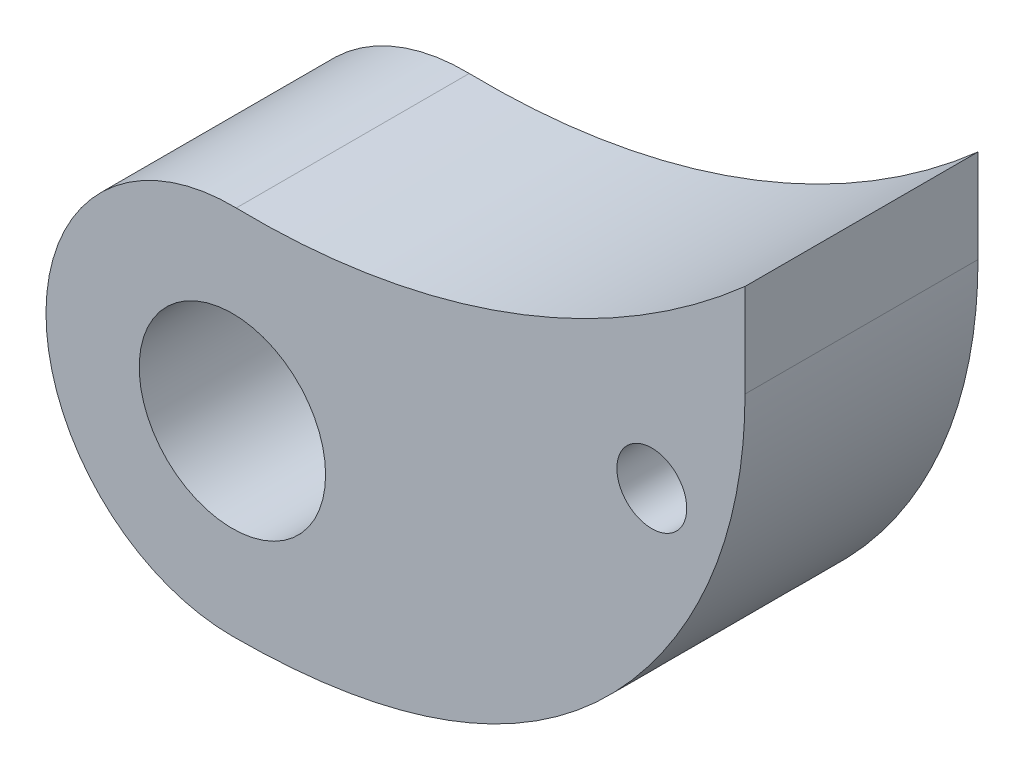
ISO-10303-21;
HEADER;
FILE_DESCRIPTION(('STEP AP214'),'2;1');
FILE_NAME('part.step','',(''),(''),'','','');
FILE_SCHEMA(('AUTOMOTIVE_DESIGN { 1 0 10303 214 1 1 1 1 }'));
ENDSEC;
DATA;
#1=APPLICATION_CONTEXT('core data for automotive mechanical design processes');
#2=APPLICATION_PROTOCOL_DEFINITION('international standard','automotive_design',2000,#1);
#3=PRODUCT_CONTEXT('',#1,'mechanical');
#4=PRODUCT('Part','Part','',(#3));
#5=PRODUCT_RELATED_PRODUCT_CATEGORY('part','',(#4));
#6=PRODUCT_DEFINITION_FORMATION('','',#4);
#7=PRODUCT_DEFINITION_CONTEXT('part definition',#1,'design');
#8=PRODUCT_DEFINITION('design','',#6,#7);
#9=PRODUCT_DEFINITION_SHAPE('','',#8);
#10=(LENGTH_UNIT() NAMED_UNIT(*) SI_UNIT(.MILLI.,.METRE.));
#11=(NAMED_UNIT(*) PLANE_ANGLE_UNIT() SI_UNIT($,.RADIAN.));
#12=(NAMED_UNIT(*) SI_UNIT($,.STERADIAN.) SOLID_ANGLE_UNIT());
#13=UNCERTAINTY_MEASURE_WITH_UNIT(LENGTH_MEASURE(1.E-05),#10,'distance_accuracy_value','');
#14=(GEOMETRIC_REPRESENTATION_CONTEXT(3) GLOBAL_UNCERTAINTY_ASSIGNED_CONTEXT((#13)) GLOBAL_UNIT_ASSIGNED_CONTEXT((#10,
#11,#12)) REPRESENTATION_CONTEXT('',''));
#15=CARTESIAN_POINT('',(0.,0.,0.));
#16=DIRECTION('',(0.,0.,1.));
#17=DIRECTION('',(1.,0.,0.));
#18=AXIS2_PLACEMENT_3D('',#15,#16,#17);
#19=CARTESIAN_POINT('',(0.412180191892476,19.9957522361478,5.));
#20=DIRECTION('',(0.,0.,1.));
#21=DIRECTION('',(1.,0.,0.));
#22=AXIS2_PLACEMENT_3D('',#19,#20,#21);
#23=PLANE('',#22);
#24=CARTESIAN_POINT('',(0.,0.,5.));
#25=DIRECTION('',(0.,0.,1.));
#26=DIRECTION('',(1.,0.,0.));
#27=AXIS2_PLACEMENT_3D('',#24,#25,#26);
#28=CIRCLE('',#27,2.);
#29=CARTESIAN_POINT('',(2.,0.,5.));
#30=VERTEX_POINT('',#29);
#31=EDGE_CURVE('E147',#30,#30,#28,.T.);
#32=ORIENTED_EDGE('',*,*,#31,.F.);
#33=EDGE_LOOP('',(#32));
#34=FACE_BOUND('',#33,.T.);
#35=CARTESIAN_POINT('',(0.412180191892476,19.9957522361478,5.));
#36=DIRECTION('',(0.,0.,-1.));
#37=DIRECTION('',(1.,0.,0.));
#38=AXIS2_PLACEMENT_3D('',#35,#36,#37);
#39=CIRCLE('',#38,16.);
#40=CARTESIAN_POINT('',(11.,8.,5.));
#41=VERTEX_POINT('',#40);
#42=CARTESIAN_POINT('',(0.0824360383784953,3.99915044722957,5.));
#43=VERTEX_POINT('',#42);
#44=EDGE_CURVE('E88',#41,#43,#39,.T.);
#45=ORIENTED_EDGE('',*,*,#44,.T.);
#46=CARTESIAN_POINT('',(0.,0.,5.));
#47=DIRECTION('',(0.,0.,1.));
#48=DIRECTION('',(1.,0.,0.));
#49=AXIS2_PLACEMENT_3D('',#46,#47,#48);
#50=CIRCLE('',#49,4.);
#51=CARTESIAN_POINT('',(0.,-4.,5.));
#52=VERTEX_POINT('',#51);
#53=EDGE_CURVE('E83',#43,#52,#50,.T.);
#54=ORIENTED_EDGE('',*,*,#53,.T.);
#55=CARTESIAN_POINT('',(0.,-4.,5.));
#56=CARTESIAN_POINT('',(4.2020349893536,-4.,5.));
#57=CARTESIAN_POINT('',(8.98329257181985,-1.55655756657849,5.));
#58=CARTESIAN_POINT('',(11.,3.64860659413861,5.));
#59=CARTESIAN_POINT('',(11.,6.,5.));
#60=B_SPLINE_CURVE_WITH_KNOTS('',3,(#55,#56,#57,#58,#59),.UNSPECIFIED.,.F.,.F.,(4,1,4),(0.,
0.608953578779127,1.),.UNSPECIFIED.);
#61=CARTESIAN_POINT('',(11.,6.,5.));
#62=VERTEX_POINT('',#61);
#63=EDGE_CURVE('E86',#52,#62,#60,.T.);
#64=ORIENTED_EDGE('',*,*,#63,.T.);
#65=DIRECTION('',(0.,1.,0.));
#66=VECTOR('',#65,1.);
#67=CARTESIAN_POINT('',(11.,8.,5.));
#68=LINE('',#67,#66);
#69=EDGE_CURVE('E53',#62,#41,#68,.T.);
#70=ORIENTED_EDGE('',*,*,#69,.T.);
#71=EDGE_LOOP('',(#45,#54,#64,#70));
#72=FACE_BOUND('',#71,.T.);
#73=CARTESIAN_POINT('',(9.,3.24788813764988,5.));
#74=DIRECTION('',(0.,0.,1.));
#75=DIRECTION('',(1.,0.,0.));
#76=AXIS2_PLACEMENT_3D('',#73,#74,#75);
#77=CIRCLE('',#76,0.750000000000002);
#78=CARTESIAN_POINT('',(9.75,3.24788813764988,5.));
#79=VERTEX_POINT('',#78);
#80=EDGE_CURVE('E138',#79,#79,#77,.T.);
#81=ORIENTED_EDGE('',*,*,#80,.F.);
#82=EDGE_LOOP('',(#81));
#83=FACE_BOUND('',#82,.T.);
#84=ADVANCED_FACE('F36',(#34,#72,#83),#23,.T.);
#85=CARTESIAN_POINT('',(0.412180191892476,19.9957522361478,0.));
#86=DIRECTION('',(0.,0.,1.));
#87=DIRECTION('',(1.,0.,0.));
#88=AXIS2_PLACEMENT_3D('',#85,#86,#87);
#89=PLANE('',#88);
#90=CARTESIAN_POINT('',(0.412180191892476,19.9957522361478,0.));
#91=DIRECTION('',(0.,0.,-1.));
#92=DIRECTION('',(1.,0.,0.));
#93=AXIS2_PLACEMENT_3D('',#90,#91,#92);
#94=CIRCLE('',#93,16.);
#95=CARTESIAN_POINT('',(11.,8.,0.));
#96=VERTEX_POINT('',#95);
#97=CARTESIAN_POINT('',(0.0824360383784953,3.99915044722957,0.));
#98=VERTEX_POINT('',#97);
#99=EDGE_CURVE('E150',#96,#98,#94,.T.);
#100=ORIENTED_EDGE('',*,*,#99,.F.);
#101=DIRECTION('',(0.,1.,0.));
#102=VECTOR('',#101,1.);
#103=CARTESIAN_POINT('',(11.,8.,0.));
#104=LINE('',#103,#102);
#105=CARTESIAN_POINT('',(11.,6.,0.));
#106=VERTEX_POINT('',#105);
#107=EDGE_CURVE('E76',#106,#96,#104,.T.);
#108=ORIENTED_EDGE('',*,*,#107,.F.);
#109=CARTESIAN_POINT('',(0.,-4.,0.));
#110=CARTESIAN_POINT('',(4.2020349893536,-4.,0.));
#111=CARTESIAN_POINT('',(8.98329257181985,-1.55655756657849,0.));
#112=CARTESIAN_POINT('',(11.,3.64860659413861,0.));
#113=CARTESIAN_POINT('',(11.,6.,0.));
#114=B_SPLINE_CURVE_WITH_KNOTS('',3,(#109,#110,#111,#112,#113),.UNSPECIFIED.,.F.,.F.,(4,1,4),
(0.,0.608953578779127,1.),.UNSPECIFIED.);
#115=CARTESIAN_POINT('',(0.,-4.,0.));
#116=VERTEX_POINT('',#115);
#117=EDGE_CURVE('E70',#116,#106,#114,.T.);
#118=ORIENTED_EDGE('',*,*,#117,.F.);
#119=CARTESIAN_POINT('',(0.,0.,0.));
#120=DIRECTION('',(0.,0.,1.));
#121=DIRECTION('',(1.,0.,0.));
#122=AXIS2_PLACEMENT_3D('',#119,#120,#121);
#123=CIRCLE('',#122,4.);
#124=EDGE_CURVE('E92',#98,#116,#123,.T.);
#125=ORIENTED_EDGE('',*,*,#124,.F.);
#126=EDGE_LOOP('',(#100,#108,#118,#125));
#127=FACE_BOUND('',#126,.T.);
#128=CARTESIAN_POINT('',(0.,0.,0.));
#129=DIRECTION('',(0.,0.,1.));
#130=DIRECTION('',(1.,0.,0.));
#131=AXIS2_PLACEMENT_3D('',#128,#129,#130);
#132=CIRCLE('',#131,2.);
#133=CARTESIAN_POINT('',(2.,0.,0.));
#134=VERTEX_POINT('',#133);
#135=EDGE_CURVE('E144',#134,#134,#132,.T.);
#136=ORIENTED_EDGE('',*,*,#135,.T.);
#137=EDGE_LOOP('',(#136));
#138=FACE_BOUND('',#137,.T.);
#139=CARTESIAN_POINT('',(9.,3.24788813764988,0.));
#140=DIRECTION('',(0.,0.,1.));
#141=DIRECTION('',(1.,0.,0.));
#142=AXIS2_PLACEMENT_3D('',#139,#140,#141);
#143=CIRCLE('',#142,0.750000000000002);
#144=CARTESIAN_POINT('',(9.75,3.24788813764988,0.));
#145=VERTEX_POINT('',#144);
#146=EDGE_CURVE('E141',#145,#145,#143,.T.);
#147=ORIENTED_EDGE('',*,*,#146,.T.);
#148=EDGE_LOOP('',(#147));
#149=FACE_BOUND('',#148,.T.);
#150=ADVANCED_FACE('F115',(#127,#138,#149),#89,.F.);
#151=CARTESIAN_POINT('',(0.412180191892476,19.9957522361478,5.));
#152=DIRECTION('',(0.,0.,-1.));
#153=DIRECTION('',(-1.,0.,0.));
#154=AXIS2_PLACEMENT_3D('',#151,#152,#153);
#155=CYLINDRICAL_SURFACE('',#154,16.);
#156=ORIENTED_EDGE('',*,*,#99,.T.);
#157=DIRECTION('',(0.,0.,-1.));
#158=VECTOR('',#157,1.);
#159=CARTESIAN_POINT('',(0.0824360383784953,3.99915044722957,5.));
#160=LINE('',#159,#158);
#161=EDGE_CURVE('E11',#43,#98,#160,.T.);
#162=ORIENTED_EDGE('',*,*,#161,.F.);
#163=ORIENTED_EDGE('',*,*,#44,.F.);
#164=DIRECTION('',(0.,0.,-1.));
#165=VECTOR('',#164,1.);
#166=CARTESIAN_POINT('',(11.,8.,5.));
#167=LINE('',#166,#165);
#168=EDGE_CURVE('E96',#41,#96,#167,.T.);
#169=ORIENTED_EDGE('',*,*,#168,.T.);
#170=EDGE_LOOP('',(#156,#162,#163,#169));
#171=FACE_BOUND('',#170,.T.);
#172=ADVANCED_FACE('F38',(#171),#155,.F.);
#173=CARTESIAN_POINT('',(0.,0.,5.));
#174=DIRECTION('',(0.,0.,-1.));
#175=DIRECTION('',(-1.,0.,0.));
#176=AXIS2_PLACEMENT_3D('',#173,#174,#175);
#177=CYLINDRICAL_SURFACE('',#176,4.);
#178=ORIENTED_EDGE('',*,*,#124,.T.);
#179=DIRECTION('',(0.,0.,-1.));
#180=VECTOR('',#179,1.);
#181=CARTESIAN_POINT('',(0.,-4.,5.));
#182=LINE('',#181,#180);
#183=EDGE_CURVE('E45',#52,#116,#182,.T.);
#184=ORIENTED_EDGE('',*,*,#183,.F.);
#185=ORIENTED_EDGE('',*,*,#53,.F.);
#186=ORIENTED_EDGE('',*,*,#161,.T.);
#187=EDGE_LOOP('',(#178,#184,#185,#186));
#188=FACE_BOUND('',#187,.T.);
#189=ADVANCED_FACE('F91',(#188),#177,.T.);
#190=DIRECTION('',(0.,0.,-1.));
#191=VECTOR('',#190,1.);
#192=SURFACE_OF_LINEAR_EXTRUSION('',#60,#191);
#193=ORIENTED_EDGE('',*,*,#117,.T.);
#194=DIRECTION('',(0.,0.,-1.));
#195=VECTOR('',#194,1.);
#196=CARTESIAN_POINT('',(11.,6.,5.));
#197=LINE('',#196,#195);
#198=EDGE_CURVE('E93',#62,#106,#197,.T.);
#199=ORIENTED_EDGE('',*,*,#198,.F.);
#200=ORIENTED_EDGE('',*,*,#63,.F.);
#201=ORIENTED_EDGE('',*,*,#183,.T.);
#202=EDGE_LOOP('',(#193,#199,#200,#201));
#203=FACE_BOUND('',#202,.T.);
#204=ADVANCED_FACE('F94',(#203),#192,.F.);
#205=CARTESIAN_POINT('',(11.,8.,5.));
#206=DIRECTION('',(-1.,0.,0.));
#207=DIRECTION('',(0.,-1.,0.));
#208=AXIS2_PLACEMENT_3D('',#205,#206,#207);
#209=PLANE('',#208);
#210=ORIENTED_EDGE('',*,*,#107,.T.);
#211=ORIENTED_EDGE('',*,*,#168,.F.);
#212=ORIENTED_EDGE('',*,*,#69,.F.);
#213=ORIENTED_EDGE('',*,*,#198,.T.);
#214=EDGE_LOOP('',(#210,#211,#212,#213));
#215=FACE_BOUND('',#214,.T.);
#216=ADVANCED_FACE('F109',(#215),#209,.F.);
#217=CARTESIAN_POINT('',(0.,0.,5.));
#218=DIRECTION('',(0.,0.,-1.));
#219=DIRECTION('',(-1.,0.,0.));
#220=AXIS2_PLACEMENT_3D('',#217,#218,#219);
#221=CYLINDRICAL_SURFACE('',#220,2.);
#222=ORIENTED_EDGE('',*,*,#31,.T.);
#223=EDGE_LOOP('',(#222));
#224=FACE_BOUND('',#223,.T.);
#225=ORIENTED_EDGE('',*,*,#135,.F.);
#226=EDGE_LOOP('',(#225));
#227=FACE_BOUND('',#226,.T.);
#228=ADVANCED_FACE('F126',(#224,#227),#221,.F.);
#229=CARTESIAN_POINT('',(9.,3.24788813764988,5.));
#230=DIRECTION('',(0.,0.,-1.));
#231=DIRECTION('',(-1.,0.,0.));
#232=AXIS2_PLACEMENT_3D('',#229,#230,#231);
#233=CYLINDRICAL_SURFACE('',#232,0.750000000000002);
#234=ORIENTED_EDGE('',*,*,#80,.T.);
#235=EDGE_LOOP('',(#234));
#236=FACE_BOUND('',#235,.T.);
#237=ORIENTED_EDGE('',*,*,#146,.F.);
#238=EDGE_LOOP('',(#237));
#239=FACE_BOUND('',#238,.T.);
#240=ADVANCED_FACE('F129',(#236,#239),#233,.F.);
#241=CLOSED_SHELL('',(#84,#150,#172,#189,#204,#216,#228,#240));
#242=MANIFOLD_SOLID_BREP('B2',#241);
#243=ADVANCED_BREP_SHAPE_REPRESENTATION('',(#18,#242),#14);
#244=SHAPE_DEFINITION_REPRESENTATION(#9,#243);
ENDSEC;
END-ISO-10303-21;
